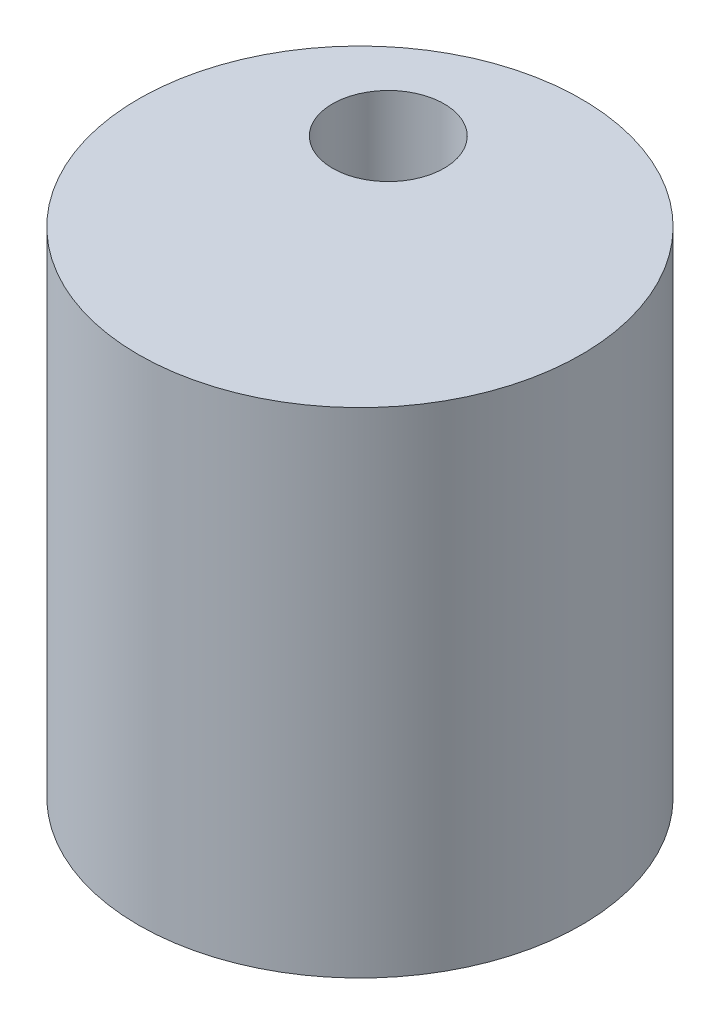
ISO-10303-21;
HEADER;
FILE_DESCRIPTION(('STEP AP214'),'2;1');
FILE_NAME('part.step','',(''),(''),'','','');
FILE_SCHEMA(('AUTOMOTIVE_DESIGN { 1 0 10303 214 1 1 1 1 }'));
ENDSEC;
DATA;
#1=APPLICATION_CONTEXT('core data for automotive mechanical design processes');
#2=APPLICATION_PROTOCOL_DEFINITION('international standard','automotive_design',2000,#1);
#3=PRODUCT_CONTEXT('',#1,'mechanical');
#4=PRODUCT('Part','Part','',(#3));
#5=PRODUCT_RELATED_PRODUCT_CATEGORY('part','',(#4));
#6=PRODUCT_DEFINITION_FORMATION('','',#4);
#7=PRODUCT_DEFINITION_CONTEXT('part definition',#1,'design');
#8=PRODUCT_DEFINITION('design','',#6,#7);
#9=PRODUCT_DEFINITION_SHAPE('','',#8);
#10=(LENGTH_UNIT() NAMED_UNIT(*) SI_UNIT(.MILLI.,.METRE.));
#11=(NAMED_UNIT(*) PLANE_ANGLE_UNIT() SI_UNIT($,.RADIAN.));
#12=(NAMED_UNIT(*) SI_UNIT($,.STERADIAN.) SOLID_ANGLE_UNIT());
#13=UNCERTAINTY_MEASURE_WITH_UNIT(LENGTH_MEASURE(1.E-05),#10,'distance_accuracy_value','');
#14=(GEOMETRIC_REPRESENTATION_CONTEXT(3) GLOBAL_UNCERTAINTY_ASSIGNED_CONTEXT((#13)) GLOBAL_UNIT_ASSIGNED_CONTEXT((#10,
#11,#12)) REPRESENTATION_CONTEXT('',''));
#15=CARTESIAN_POINT('',(0.,0.,0.));
#16=DIRECTION('',(0.,0.,1.));
#17=DIRECTION('',(1.,0.,0.));
#18=AXIS2_PLACEMENT_3D('',#15,#16,#17);
#19=CARTESIAN_POINT('',(0.,-29.21,0.));
#20=DIRECTION('',(0.,1.,0.));
#21=DIRECTION('',(0.,0.,1.));
#22=AXIS2_PLACEMENT_3D('',#19,#20,#21);
#23=CYLINDRICAL_SURFACE('',#22,13.0937);
#24=CARTESIAN_POINT('',(0.,-29.21,0.));
#25=DIRECTION('',(0.,1.,0.));
#26=DIRECTION('',(0.,0.,1.));
#27=AXIS2_PLACEMENT_3D('',#24,#25,#26);
#28=CIRCLE('',#27,13.0937);
#29=CARTESIAN_POINT('',(0.,-29.21,13.0937));
#30=VERTEX_POINT('',#29);
#31=EDGE_CURVE('E10',#30,#30,#28,.T.);
#32=CARTESIAN_POINT('',(0.,0.,0.));
#33=DIRECTION('',(0.,1.,0.));
#34=DIRECTION('',(0.,0.,1.));
#35=AXIS2_PLACEMENT_3D('',#32,#33,#34);
#36=CIRCLE('',#35,13.0937);
#37=CARTESIAN_POINT('',(0.,0.,13.0937));
#38=VERTEX_POINT('',#37);
#39=EDGE_CURVE('E35',#38,#38,#36,.T.);
#40=CARTESIAN_POINT('',(0.,-29.21,13.0937));
#41=CARTESIAN_POINT('',(0.,-28.9057291666667,13.0937));
#42=CARTESIAN_POINT('',(0.,-28.6014583333333,13.0937));
#43=CARTESIAN_POINT('',(0.,-27.9929166666667,13.0937));
#44=CARTESIAN_POINT('',(0.,-27.6886458333333,13.0937));
#45=CARTESIAN_POINT('',(0.,-27.0801041666667,13.0937));
#46=CARTESIAN_POINT('',(0.,-26.7758333333333,13.0937));
#47=CARTESIAN_POINT('',(0.,-26.1672916666667,13.0937));
#48=CARTESIAN_POINT('',(0.,-25.8630208333333,13.0937));
#49=CARTESIAN_POINT('',(0.,-25.2544791666667,13.0937));
#50=CARTESIAN_POINT('',(0.,-24.9502083333333,13.0937));
#51=CARTESIAN_POINT('',(0.,-24.3416666666667,13.0937));
#52=CARTESIAN_POINT('',(0.,-24.0373958333333,13.0937));
#53=CARTESIAN_POINT('',(0.,-23.4288541666667,13.0937));
#54=CARTESIAN_POINT('',(0.,-23.1245833333333,13.0937));
#55=CARTESIAN_POINT('',(0.,-22.5160416666667,13.0937));
#56=CARTESIAN_POINT('',(0.,-22.2117708333333,13.0937));
#57=CARTESIAN_POINT('',(0.,-21.6032291666667,13.0937));
#58=CARTESIAN_POINT('',(0.,-21.2989583333333,13.0937));
#59=CARTESIAN_POINT('',(0.,-20.6904166666667,13.0937));
#60=CARTESIAN_POINT('',(0.,-20.3861458333333,13.0937));
#61=CARTESIAN_POINT('',(0.,-19.7776041666667,13.0937));
#62=CARTESIAN_POINT('',(0.,-19.4733333333333,13.0937));
#63=CARTESIAN_POINT('',(0.,-18.8647916666667,13.0937));
#64=CARTESIAN_POINT('',(0.,-18.5605208333333,13.0937));
#65=CARTESIAN_POINT('',(0.,-17.9519791666667,13.0937));
#66=CARTESIAN_POINT('',(0.,-17.6477083333333,13.0937));
#67=CARTESIAN_POINT('',(0.,-17.0391666666667,13.0937));
#68=CARTESIAN_POINT('',(0.,-16.7348958333333,13.0937));
#69=CARTESIAN_POINT('',(0.,-16.1263541666667,13.0937));
#70=CARTESIAN_POINT('',(0.,-15.8220833333333,13.0937));
#71=CARTESIAN_POINT('',(0.,-15.2135416666667,13.0937));
#72=CARTESIAN_POINT('',(0.,-14.9092708333333,13.0937));
#73=CARTESIAN_POINT('',(0.,-14.3007291666667,13.0937));
#74=CARTESIAN_POINT('',(0.,-13.9964583333333,13.0937));
#75=CARTESIAN_POINT('',(0.,-13.3879166666667,13.0937));
#76=CARTESIAN_POINT('',(0.,-13.0836458333333,13.0937));
#77=CARTESIAN_POINT('',(0.,-12.4751041666667,13.0937));
#78=CARTESIAN_POINT('',(0.,-12.1708333333333,13.0937));
#79=CARTESIAN_POINT('',(0.,-11.5622916666667,13.0937));
#80=CARTESIAN_POINT('',(0.,-11.2580208333333,13.0937));
#81=CARTESIAN_POINT('',(0.,-10.6494791666667,13.0937));
#82=CARTESIAN_POINT('',(0.,-10.3452083333333,13.0937));
#83=CARTESIAN_POINT('',(0.,-9.73666666666667,13.0937));
#84=CARTESIAN_POINT('',(0.,-9.43239583333333,13.0937));
#85=CARTESIAN_POINT('',(0.,-8.82385416666667,13.0937));
#86=CARTESIAN_POINT('',(0.,-8.51958333333334,13.0937));
#87=CARTESIAN_POINT('',(0.,-7.91104166666667,13.0937));
#88=CARTESIAN_POINT('',(0.,-7.60677083333333,13.0937));
#89=CARTESIAN_POINT('',(0.,-6.99822916666667,13.0937));
#90=CARTESIAN_POINT('',(0.,-6.69395833333333,13.0937));
#91=CARTESIAN_POINT('',(0.,-6.08541666666667,13.0937));
#92=CARTESIAN_POINT('',(0.,-5.78114583333333,13.0937));
#93=CARTESIAN_POINT('',(0.,-5.17260416666667,13.0937));
#94=CARTESIAN_POINT('',(0.,-4.86833333333333,13.0937));
#95=CARTESIAN_POINT('',(0.,-4.25979166666667,13.0937));
#96=CARTESIAN_POINT('',(0.,-3.95552083333333,13.0937));
#97=CARTESIAN_POINT('',(0.,-3.34697916666667,13.0937));
#98=CARTESIAN_POINT('',(0.,-3.04270833333333,13.0937));
#99=CARTESIAN_POINT('',(0.,-2.43416666666667,13.0937));
#100=CARTESIAN_POINT('',(0.,-2.12989583333333,13.0937));
#101=CARTESIAN_POINT('',(0.,-1.52135416666667,13.0937));
#102=CARTESIAN_POINT('',(0.,-1.21708333333333,13.0937));
#103=CARTESIAN_POINT('',(0.,-0.608541666666666,13.0937));
#104=CARTESIAN_POINT('',(0.,-0.304270833333333,13.0937));
#105=CARTESIAN_POINT('',(0.,0.,13.0937));
#106=B_SPLINE_CURVE_WITH_KNOTS('',3,(#40,#41,#42,#43,#44,#45,#46,#47,#48,#49,#50,#51,#52,#53,
#54,#55,#56,#57,#58,#59,#60,#61,#62,#63,#64,#65,#66,#67,#68,#69,#70,#71,#72,#73,#74,#75,#76,#77,
#78,#79,#80,#81,#82,#83,#84,#85,#86,#87,#88,#89,#90,#91,#92,#93,#94,#95,#96,#97,#98,#99,#100,
#101,#102,#103,#104,#105),.UNSPECIFIED.,.F.,.F.,(4,2,2,2,2,2,2,2,2,2,2,2,2,2,2,2,2,2,2,2,2,2,2,
2,2,2,2,2,2,2,2,2,4),(0.,0.912812500000002,1.825625,2.7384375,3.65125,4.5640625,5.476875,
6.3896875,7.3025,8.2153125,9.128125,10.0409375,10.95375,11.8665625,12.779375,13.6921875,14.605,
15.5178125,16.430625,17.3434375,18.25625,19.1690625,20.081875,20.9946875,21.9075,22.8203125,
23.733125,24.6459375,25.55875,26.4715625,27.384375,28.2971875,29.21),.UNSPECIFIED.);
#107=EDGE_CURVE('BSEAM32',#30,#38,#106,.T.);
#108=ORIENTED_EDGE('',*,*,#31,.T.);
#109=ORIENTED_EDGE('',*,*,#39,.F.);
#110=ORIENTED_EDGE('',*,*,#107,.T.);
#111=ORIENTED_EDGE('',*,*,#107,.F.);
#112=EDGE_LOOP('',(#108,#110,#109,#111));
#113=FACE_BOUND('',#112,.T.);
#114=ADVANCED_FACE('F32',(#113),#23,.T.);
#115=CARTESIAN_POINT('',(0.,-29.21,0.));
#116=DIRECTION('',(0.,1.,0.));
#117=DIRECTION('',(0.,0.,1.));
#118=AXIS2_PLACEMENT_3D('',#115,#116,#117);
#119=PLANE('',#118);
#120=CARTESIAN_POINT('',(-3.81,-29.21,-5.4864));
#121=DIRECTION('',(0.,1.,0.));
#122=DIRECTION('',(0.,0.,1.));
#123=AXIS2_PLACEMENT_3D('',#120,#121,#122);
#124=CIRCLE('',#123,3.302);
#125=CARTESIAN_POINT('',(-3.81,-29.21,-2.1844));
#126=VERTEX_POINT('',#125);
#127=EDGE_CURVE('E42',#126,#126,#124,.T.);
#128=ORIENTED_EDGE('',*,*,#127,.T.);
#129=EDGE_LOOP('',(#128));
#130=FACE_BOUND('',#129,.T.);
#131=ORIENTED_EDGE('',*,*,#31,.F.);
#132=EDGE_LOOP('',(#131));
#133=FACE_BOUND('',#132,.T.);
#134=ADVANCED_FACE('F50',(#130,#133),#119,.F.);
#135=CARTESIAN_POINT('',(0.,0.,0.));
#136=DIRECTION('',(0.,1.,0.));
#137=DIRECTION('',(0.,0.,1.));
#138=AXIS2_PLACEMENT_3D('',#135,#136,#137);
#139=PLANE('',#138);
#140=CARTESIAN_POINT('',(-3.81,0.,-5.4864));
#141=DIRECTION('',(0.,1.,0.));
#142=DIRECTION('',(0.,0.,1.));
#143=AXIS2_PLACEMENT_3D('',#140,#141,#142);
#144=CIRCLE('',#143,3.302);
#145=CARTESIAN_POINT('',(-3.81,0.,-2.1844));
#146=VERTEX_POINT('',#145);
#147=EDGE_CURVE('E44',#146,#146,#144,.T.);
#148=ORIENTED_EDGE('',*,*,#147,.F.);
#149=EDGE_LOOP('',(#148));
#150=FACE_BOUND('',#149,.T.);
#151=ORIENTED_EDGE('',*,*,#39,.T.);
#152=EDGE_LOOP('',(#151));
#153=FACE_BOUND('',#152,.T.);
#154=ADVANCED_FACE('F56',(#150,#153),#139,.T.);
#155=CARTESIAN_POINT('',(-3.81,-29.21,-5.4864));
#156=DIRECTION('',(0.,1.,0.));
#157=DIRECTION('',(0.,0.,1.));
#158=AXIS2_PLACEMENT_3D('',#155,#156,#157);
#159=CYLINDRICAL_SURFACE('',#158,3.302);
#160=CARTESIAN_POINT('',(-3.81,-29.21,-2.1844));
#161=CARTESIAN_POINT('',(-3.81,-28.9057291666667,-2.1844));
#162=CARTESIAN_POINT('',(-3.81,-28.6014583333333,-2.1844));
#163=CARTESIAN_POINT('',(-3.81,-27.9929166666667,-2.1844));
#164=CARTESIAN_POINT('',(-3.81,-27.6886458333333,-2.1844));
#165=CARTESIAN_POINT('',(-3.81,-27.0801041666667,-2.1844));
#166=CARTESIAN_POINT('',(-3.81,-26.7758333333333,-2.1844));
#167=CARTESIAN_POINT('',(-3.81,-26.1672916666667,-2.1844));
#168=CARTESIAN_POINT('',(-3.81,-25.8630208333333,-2.1844));
#169=CARTESIAN_POINT('',(-3.81,-25.2544791666667,-2.1844));
#170=CARTESIAN_POINT('',(-3.81,-24.9502083333333,-2.1844));
#171=CARTESIAN_POINT('',(-3.81,-24.3416666666667,-2.1844));
#172=CARTESIAN_POINT('',(-3.81,-24.0373958333333,-2.1844));
#173=CARTESIAN_POINT('',(-3.81,-23.4288541666667,-2.1844));
#174=CARTESIAN_POINT('',(-3.81,-23.1245833333333,-2.1844));
#175=CARTESIAN_POINT('',(-3.81,-22.5160416666667,-2.1844));
#176=CARTESIAN_POINT('',(-3.81,-22.2117708333333,-2.1844));
#177=CARTESIAN_POINT('',(-3.81,-21.6032291666667,-2.1844));
#178=CARTESIAN_POINT('',(-3.81,-21.2989583333333,-2.1844));
#179=CARTESIAN_POINT('',(-3.81,-20.6904166666667,-2.1844));
#180=CARTESIAN_POINT('',(-3.81,-20.3861458333333,-2.1844));
#181=CARTESIAN_POINT('',(-3.81,-19.7776041666667,-2.1844));
#182=CARTESIAN_POINT('',(-3.81,-19.4733333333333,-2.1844));
#183=CARTESIAN_POINT('',(-3.81,-18.8647916666667,-2.1844));
#184=CARTESIAN_POINT('',(-3.81,-18.5605208333333,-2.1844));
#185=CARTESIAN_POINT('',(-3.81,-17.9519791666667,-2.1844));
#186=CARTESIAN_POINT('',(-3.81,-17.6477083333333,-2.1844));
#187=CARTESIAN_POINT('',(-3.81,-17.0391666666667,-2.1844));
#188=CARTESIAN_POINT('',(-3.81,-16.7348958333333,-2.1844));
#189=CARTESIAN_POINT('',(-3.81,-16.1263541666667,-2.1844));
#190=CARTESIAN_POINT('',(-3.81,-15.8220833333333,-2.1844));
#191=CARTESIAN_POINT('',(-3.81,-15.2135416666667,-2.1844));
#192=CARTESIAN_POINT('',(-3.81,-14.9092708333333,-2.1844));
#193=CARTESIAN_POINT('',(-3.81,-14.3007291666667,-2.1844));
#194=CARTESIAN_POINT('',(-3.81,-13.9964583333333,-2.1844));
#195=CARTESIAN_POINT('',(-3.81,-13.3879166666667,-2.1844));
#196=CARTESIAN_POINT('',(-3.81,-13.0836458333333,-2.1844));
#197=CARTESIAN_POINT('',(-3.81,-12.4751041666667,-2.1844));
#198=CARTESIAN_POINT('',(-3.81,-12.1708333333333,-2.1844));
#199=CARTESIAN_POINT('',(-3.81,-11.5622916666667,-2.1844));
#200=CARTESIAN_POINT('',(-3.81,-11.2580208333333,-2.1844));
#201=CARTESIAN_POINT('',(-3.81,-10.6494791666667,-2.1844));
#202=CARTESIAN_POINT('',(-3.81,-10.3452083333333,-2.1844));
#203=CARTESIAN_POINT('',(-3.81,-9.73666666666667,-2.1844));
#204=CARTESIAN_POINT('',(-3.81,-9.43239583333333,-2.1844));
#205=CARTESIAN_POINT('',(-3.81,-8.82385416666667,-2.1844));
#206=CARTESIAN_POINT('',(-3.81,-8.51958333333333,-2.1844));
#207=CARTESIAN_POINT('',(-3.81,-7.91104166666666,-2.1844));
#208=CARTESIAN_POINT('',(-3.81,-7.60677083333333,-2.1844));
#209=CARTESIAN_POINT('',(-3.81,-6.99822916666667,-2.1844));
#210=CARTESIAN_POINT('',(-3.81,-6.69395833333333,-2.1844));
#211=CARTESIAN_POINT('',(-3.81,-6.08541666666667,-2.1844));
#212=CARTESIAN_POINT('',(-3.81,-5.78114583333333,-2.1844));
#213=CARTESIAN_POINT('',(-3.81,-5.17260416666667,-2.1844));
#214=CARTESIAN_POINT('',(-3.81,-4.86833333333333,-2.1844));
#215=CARTESIAN_POINT('',(-3.81,-4.25979166666667,-2.1844));
#216=CARTESIAN_POINT('',(-3.81,-3.95552083333333,-2.1844));
#217=CARTESIAN_POINT('',(-3.81,-3.34697916666667,-2.1844));
#218=CARTESIAN_POINT('',(-3.81,-3.04270833333333,-2.1844));
#219=CARTESIAN_POINT('',(-3.81,-2.43416666666667,-2.1844));
#220=CARTESIAN_POINT('',(-3.81,-2.12989583333333,-2.1844));
#221=CARTESIAN_POINT('',(-3.81,-1.52135416666667,-2.1844));
#222=CARTESIAN_POINT('',(-3.81,-1.21708333333333,-2.1844));
#223=CARTESIAN_POINT('',(-3.81,-0.608541666666666,-2.1844));
#224=CARTESIAN_POINT('',(-3.81,-0.304270833333333,-2.1844));
#225=CARTESIAN_POINT('',(-3.81,0.,-2.1844));
#226=B_SPLINE_CURVE_WITH_KNOTS('',3,(#160,#161,#162,#163,#164,#165,#166,#167,#168,#169,#170,
#171,#172,#173,#174,#175,#176,#177,#178,#179,#180,#181,#182,#183,#184,#185,#186,#187,#188,#189,
#190,#191,#192,#193,#194,#195,#196,#197,#198,#199,#200,#201,#202,#203,#204,#205,#206,#207,#208,
#209,#210,#211,#212,#213,#214,#215,#216,#217,#218,#219,#220,#221,#222,#223,#224,#225),
.UNSPECIFIED.,.F.,.F.,(4,2,2,2,2,2,2,2,2,2,2,2,2,2,2,2,2,2,2,2,2,2,2,2,2,2,2,2,2,2,2,2,4),(0.,
0.912812499999999,1.825625,2.7384375,3.65125,4.5640625,5.476875,6.3896875,7.3025,8.2153125,
9.128125,10.0409375,10.95375,11.8665625,12.779375,13.6921875,14.605,15.5178125,16.430625,
17.3434375,18.25625,19.1690625,20.081875,20.9946875,21.9075,22.8203125,23.733125,24.6459375,
25.55875,26.4715625,27.384375,28.2971875,29.21),.UNSPECIFIED.);
#227=EDGE_CURVE('BSEAM53',#126,#146,#226,.T.);
#228=ORIENTED_EDGE('',*,*,#127,.F.);
#229=ORIENTED_EDGE('',*,*,#147,.T.);
#230=ORIENTED_EDGE('',*,*,#227,.T.);
#231=ORIENTED_EDGE('',*,*,#227,.F.);
#232=EDGE_LOOP('',(#228,#230,#229,#231));
#233=FACE_BOUND('',#232,.T.);
#234=ADVANCED_FACE('F53',(#233),#159,.F.);
#235=CLOSED_SHELL('',(#114,#134,#154,#234));
#236=MANIFOLD_SOLID_BREP('B2',#235);
#237=ADVANCED_BREP_SHAPE_REPRESENTATION('',(#18,#236),#14);
#238=SHAPE_DEFINITION_REPRESENTATION(#9,#237);
ENDSEC;
END-ISO-10303-21;
